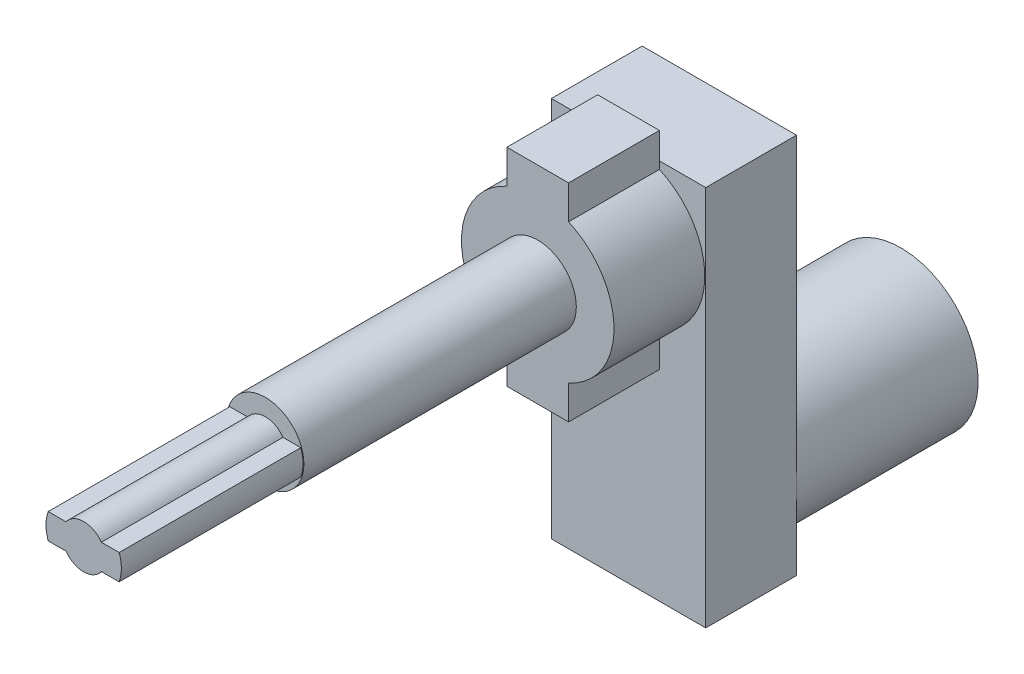
ISO-10303-21;
HEADER;
FILE_DESCRIPTION(('STEP AP214'),'2;1');
FILE_NAME('part.step','',(''),(''),'','','');
FILE_SCHEMA(('AUTOMOTIVE_DESIGN { 1 0 10303 214 1 1 1 1 }'));
ENDSEC;
DATA;
#1=APPLICATION_CONTEXT('core data for automotive mechanical design processes');
#2=APPLICATION_PROTOCOL_DEFINITION('international standard','automotive_design',2000,#1);
#3=PRODUCT_CONTEXT('',#1,'mechanical');
#4=PRODUCT('Part','Part','',(#3));
#5=PRODUCT_RELATED_PRODUCT_CATEGORY('part','',(#4));
#6=PRODUCT_DEFINITION_FORMATION('','',#4);
#7=PRODUCT_DEFINITION_CONTEXT('part definition',#1,'design');
#8=PRODUCT_DEFINITION('design','',#6,#7);
#9=PRODUCT_DEFINITION_SHAPE('','',#8);
#10=(LENGTH_UNIT() NAMED_UNIT(*) SI_UNIT(.MILLI.,.METRE.));
#11=(NAMED_UNIT(*) PLANE_ANGLE_UNIT() SI_UNIT($,.RADIAN.));
#12=(NAMED_UNIT(*) SI_UNIT($,.STERADIAN.) SOLID_ANGLE_UNIT());
#13=UNCERTAINTY_MEASURE_WITH_UNIT(LENGTH_MEASURE(1.E-05),#10,'distance_accuracy_value','');
#14=(GEOMETRIC_REPRESENTATION_CONTEXT(3) GLOBAL_UNCERTAINTY_ASSIGNED_CONTEXT((#13)) GLOBAL_UNIT_ASSIGNED_CONTEXT((#10,
#11,#12)) REPRESENTATION_CONTEXT('',''));
#15=CARTESIAN_POINT('',(0.,0.,0.));
#16=DIRECTION('',(0.,0.,1.));
#17=DIRECTION('',(1.,0.,0.));
#18=AXIS2_PLACEMENT_3D('',#15,#16,#17);
#19=CARTESIAN_POINT('',(0.,0.,-14.));
#20=DIRECTION('',(0.,0.,1.));
#21=DIRECTION('',(1.,0.,0.));
#22=AXIS2_PLACEMENT_3D('',#19,#20,#21);
#23=PLANE('',#22);
#24=DIRECTION('',(1.,0.,0.));
#25=VECTOR('',#24,1.);
#26=CARTESIAN_POINT('',(8.5,8.5,-14.));
#27=LINE('',#26,#25);
#28=CARTESIAN_POINT('',(-3.4,8.5,-14.));
#29=VERTEX_POINT('',#28);
#30=CARTESIAN_POINT('',(3.4,8.5,-14.));
#31=VERTEX_POINT('',#30);
#32=EDGE_CURVE('E11',#29,#31,#27,.T.);
#33=ORIENTED_EDGE('',*,*,#32,.F.);
#34=DIRECTION('',(0.,-1.,0.));
#35=VECTOR('',#34,1.);
#36=CARTESIAN_POINT('',(-3.4,11.4,-14.));
#37=LINE('',#36,#35);
#38=CARTESIAN_POINT('',(-3.4,11.4,-14.));
#39=VERTEX_POINT('',#38);
#40=EDGE_CURVE('E346',#39,#29,#37,.T.);
#41=ORIENTED_EDGE('',*,*,#40,.F.);
#42=DIRECTION('',(-1.,0.,0.));
#43=VECTOR('',#42,1.);
#44=CARTESIAN_POINT('',(3.4,11.4,-14.));
#45=LINE('',#44,#43);
#46=CARTESIAN_POINT('',(3.4,11.4,-14.));
#47=VERTEX_POINT('',#46);
#48=EDGE_CURVE('E343',#47,#39,#45,.T.);
#49=ORIENTED_EDGE('',*,*,#48,.F.);
#50=DIRECTION('',(0.,1.,0.));
#51=VECTOR('',#50,1.);
#52=CARTESIAN_POINT('',(3.4,11.4,-14.));
#53=LINE('',#52,#51);
#54=EDGE_CURVE('E340',#31,#47,#53,.T.);
#55=ORIENTED_EDGE('',*,*,#54,.F.);
#56=EDGE_LOOP('',(#33,#41,#49,#55));
#57=FACE_BOUND('',#56,.T.);
#58=ADVANCED_FACE('F34',(#57),#23,.F.);
#59=CARTESIAN_POINT('',(0.,0.,26.));
#60=DIRECTION('',(0.,0.,-1.));
#61=DIRECTION('',(-1.,0.,0.));
#62=AXIS2_PLACEMENT_3D('',#59,#60,#61);
#63=CYLINDRICAL_SURFACE('',#62,4.25);
#64=CARTESIAN_POINT('',(0.,0.,26.));
#65=DIRECTION('',(0.,0.,1.));
#66=DIRECTION('',(1.,0.,0.));
#67=AXIS2_PLACEMENT_3D('',#64,#65,#66);
#68=CIRCLE('',#67,4.25);
#69=CARTESIAN_POINT('',(4.25,0.,26.));
#70=VERTEX_POINT('',#69);
#71=EDGE_CURVE('E43',#70,#70,#68,.T.);
#72=ORIENTED_EDGE('',*,*,#71,.F.);
#73=EDGE_LOOP('',(#72));
#74=FACE_BOUND('',#73,.T.);
#75=CARTESIAN_POINT('',(0.,0.,-4.));
#76=DIRECTION('',(0.,0.,1.));
#77=DIRECTION('',(1.,0.,0.));
#78=AXIS2_PLACEMENT_3D('',#75,#76,#77);
#79=CIRCLE('',#78,4.25);
#80=CARTESIAN_POINT('',(4.25,0.,-4.));
#81=VERTEX_POINT('',#80);
#82=EDGE_CURVE('E38',#81,#81,#79,.T.);
#83=ORIENTED_EDGE('',*,*,#82,.T.);
#84=EDGE_LOOP('',(#83));
#85=FACE_BOUND('',#84,.T.);
#86=ADVANCED_FACE('F36',(#74,#85),#63,.T.);
#87=CARTESIAN_POINT('',(0.,0.,26.));
#88=DIRECTION('',(0.,0.,1.));
#89=DIRECTION('',(1.,0.,0.));
#90=AXIS2_PLACEMENT_3D('',#87,#88,#89);
#91=PLANE('',#90);
#92=CARTESIAN_POINT('',(0.,0.,26.));
#93=DIRECTION('',(0.,0.,1.));
#94=DIRECTION('',(1.,0.,0.));
#95=AXIS2_PLACEMENT_3D('',#92,#93,#94);
#96=CIRCLE('',#95,2.4);
#97=CARTESIAN_POINT('',(-1.94935886896179,-1.4,26.));
#98=VERTEX_POINT('',#97);
#99=CARTESIAN_POINT('',(1.94935886896179,-1.4,26.));
#100=VERTEX_POINT('',#99);
#101=EDGE_CURVE('E53',#98,#100,#96,.T.);
#102=ORIENTED_EDGE('',*,*,#101,.F.);
#103=DIRECTION('',(1.,0.,0.));
#104=VECTOR('',#103,1.);
#105=CARTESIAN_POINT('',(-1.94935886896179,-1.4,26.));
#106=LINE('',#105,#104);
#107=CARTESIAN_POINT('',(-3.90672497112351,-1.4,26.));
#108=VERTEX_POINT('',#107);
#109=EDGE_CURVE('E57',#108,#98,#106,.T.);
#110=ORIENTED_EDGE('',*,*,#109,.F.);
#111=CARTESIAN_POINT('',(0.,0.,26.));
#112=DIRECTION('',(0.,0.,1.));
#113=DIRECTION('',(1.,0.,0.));
#114=AXIS2_PLACEMENT_3D('',#111,#112,#113);
#115=CIRCLE('',#114,4.15);
#116=CARTESIAN_POINT('',(-3.90672497112351,1.4,26.));
#117=VERTEX_POINT('',#116);
#118=EDGE_CURVE('E777',#117,#108,#115,.T.);
#119=ORIENTED_EDGE('',*,*,#118,.F.);
#120=DIRECTION('',(-1.,0.,0.));
#121=VECTOR('',#120,1.);
#122=CARTESIAN_POINT('',(-1.94935886896179,1.4,26.));
#123=LINE('',#122,#121);
#124=CARTESIAN_POINT('',(-1.94935886896179,1.4,26.));
#125=VERTEX_POINT('',#124);
#126=EDGE_CURVE('E811',#125,#117,#123,.T.);
#127=ORIENTED_EDGE('',*,*,#126,.F.);
#128=CARTESIAN_POINT('',(0.,0.,26.));
#129=DIRECTION('',(0.,0.,1.));
#130=DIRECTION('',(1.,0.,0.));
#131=AXIS2_PLACEMENT_3D('',#128,#129,#130);
#132=CIRCLE('',#131,2.4);
#133=CARTESIAN_POINT('',(1.94935886896179,1.4,26.));
#134=VERTEX_POINT('',#133);
#135=EDGE_CURVE('E804',#134,#125,#132,.T.);
#136=ORIENTED_EDGE('',*,*,#135,.F.);
#137=DIRECTION('',(-1.,0.,0.));
#138=VECTOR('',#137,1.);
#139=CARTESIAN_POINT('',(3.90672497112351,1.4,26.));
#140=LINE('',#139,#138);
#141=CARTESIAN_POINT('',(3.90672497112351,1.4,26.));
#142=VERTEX_POINT('',#141);
#143=EDGE_CURVE('E798',#142,#134,#140,.T.);
#144=ORIENTED_EDGE('',*,*,#143,.F.);
#145=CARTESIAN_POINT('',(0.,0.,26.));
#146=DIRECTION('',(0.,0.,1.));
#147=DIRECTION('',(1.,0.,0.));
#148=AXIS2_PLACEMENT_3D('',#145,#146,#147);
#149=CIRCLE('',#148,4.15);
#150=CARTESIAN_POINT('',(3.90672497112351,-1.4,26.));
#151=VERTEX_POINT('',#150);
#152=EDGE_CURVE('E801',#151,#142,#149,.T.);
#153=ORIENTED_EDGE('',*,*,#152,.F.);
#154=DIRECTION('',(1.,0.,0.));
#155=VECTOR('',#154,1.);
#156=CARTESIAN_POINT('',(3.90672497112351,-1.4,26.));
#157=LINE('',#156,#155);
#158=EDGE_CURVE('E802',#100,#151,#157,.T.);
#159=ORIENTED_EDGE('',*,*,#158,.F.);
#160=EDGE_LOOP('',(#102,#110,#119,#127,#136,#144,#153,#159));
#161=FACE_BOUND('',#160,.T.);
#162=ORIENTED_EDGE('',*,*,#71,.T.);
#163=EDGE_LOOP('',(#162));
#164=FACE_BOUND('',#163,.T.);
#165=ADVANCED_FACE('F474',(#161,#164),#91,.T.);
#166=CARTESIAN_POINT('',(-3.4,-7.68114574786861,-4.));
#167=DIRECTION('',(1.,0.,0.));
#168=DIRECTION('',(0.,1.,0.));
#169=AXIS2_PLACEMENT_3D('',#166,#167,#168);
#170=PLANE('',#169);
#171=DIRECTION('',(0.,-1.,0.));
#172=VECTOR('',#171,1.);
#173=CARTESIAN_POINT('',(-3.4,-7.68114574786861,-14.));
#174=LINE('',#173,#172);
#175=CARTESIAN_POINT('',(-3.4,-7.68114574786861,-14.));
#176=VERTEX_POINT('',#175);
#177=CARTESIAN_POINT('',(-3.4,-11.4,-14.));
#178=VERTEX_POINT('',#177);
#179=EDGE_CURVE('E331',#176,#178,#174,.T.);
#180=ORIENTED_EDGE('',*,*,#179,.T.);
#181=DIRECTION('',(0.,0.,-1.));
#182=VECTOR('',#181,1.);
#183=CARTESIAN_POINT('',(-3.4,-11.4,-4.));
#184=LINE('',#183,#182);
#185=CARTESIAN_POINT('',(-3.4,-11.4,-4.));
#186=VERTEX_POINT('',#185);
#187=EDGE_CURVE('E370',#186,#178,#184,.T.);
#188=ORIENTED_EDGE('',*,*,#187,.F.);
#189=DIRECTION('',(0.,-1.,0.));
#190=VECTOR('',#189,1.);
#191=CARTESIAN_POINT('',(-3.4,-7.68114574786861,-4.));
#192=LINE('',#191,#190);
#193=CARTESIAN_POINT('',(-3.4,-7.68114574786861,-4.));
#194=VERTEX_POINT('',#193);
#195=EDGE_CURVE('E312',#194,#186,#192,.T.);
#196=ORIENTED_EDGE('',*,*,#195,.F.);
#197=DIRECTION('',(0.,0.,-1.));
#198=VECTOR('',#197,1.);
#199=CARTESIAN_POINT('',(-3.4,-7.68114574786861,-4.));
#200=LINE('',#199,#198);
#201=EDGE_CURVE('E330',#194,#176,#200,.T.);
#202=ORIENTED_EDGE('',*,*,#201,.T.);
#203=EDGE_LOOP('',(#180,#188,#196,#202));
#204=FACE_BOUND('',#203,.T.);
#205=ADVANCED_FACE('F390',(#204),#170,.F.);
#206=CARTESIAN_POINT('',(3.4,-11.4,-4.));
#207=DIRECTION('',(0.,1.,0.));
#208=DIRECTION('',(0.,0.,1.));
#209=AXIS2_PLACEMENT_3D('',#206,#207,#208);
#210=PLANE('',#209);
#211=DIRECTION('',(1.,0.,0.));
#212=VECTOR('',#211,1.);
#213=CARTESIAN_POINT('',(3.4,-11.4,-14.));
#214=LINE('',#213,#212);
#215=CARTESIAN_POINT('',(3.4,-11.4,-14.));
#216=VERTEX_POINT('',#215);
#217=EDGE_CURVE('E334',#178,#216,#214,.T.);
#218=ORIENTED_EDGE('',*,*,#217,.T.);
#219=DIRECTION('',(0.,0.,-1.));
#220=VECTOR('',#219,1.);
#221=CARTESIAN_POINT('',(3.4,-11.4,-4.));
#222=LINE('',#221,#220);
#223=CARTESIAN_POINT('',(3.4,-11.4,-4.));
#224=VERTEX_POINT('',#223);
#225=EDGE_CURVE('E367',#224,#216,#222,.T.);
#226=ORIENTED_EDGE('',*,*,#225,.F.);
#227=DIRECTION('',(1.,0.,0.));
#228=VECTOR('',#227,1.);
#229=CARTESIAN_POINT('',(3.4,-11.4,-4.));
#230=LINE('',#229,#228);
#231=EDGE_CURVE('E315',#186,#224,#230,.T.);
#232=ORIENTED_EDGE('',*,*,#231,.F.);
#233=ORIENTED_EDGE('',*,*,#187,.T.);
#234=EDGE_LOOP('',(#218,#226,#232,#233));
#235=FACE_BOUND('',#234,.T.);
#236=ADVANCED_FACE('F394',(#235),#210,.F.);
#237=CARTESIAN_POINT('',(3.4,-7.68114574786861,-4.));
#238=DIRECTION('',(-1.,0.,0.));
#239=DIRECTION('',(0.,0.,1.));
#240=AXIS2_PLACEMENT_3D('',#237,#238,#239);
#241=PLANE('',#240);
#242=DIRECTION('',(0.,1.,0.));
#243=VECTOR('',#242,1.);
#244=CARTESIAN_POINT('',(3.4,-7.68114574786861,-14.));
#245=LINE('',#244,#243);
#246=CARTESIAN_POINT('',(3.4,-7.68114574786861,-14.));
#247=VERTEX_POINT('',#246);
#248=EDGE_CURVE('E336',#216,#247,#245,.T.);
#249=ORIENTED_EDGE('',*,*,#248,.T.);
#250=DIRECTION('',(0.,0.,-1.));
#251=VECTOR('',#250,1.);
#252=CARTESIAN_POINT('',(3.4,-7.68114574786861,-4.));
#253=LINE('',#252,#251);
#254=CARTESIAN_POINT('',(3.4,-7.68114574786861,-4.));
#255=VERTEX_POINT('',#254);
#256=EDGE_CURVE('E364',#255,#247,#253,.T.);
#257=ORIENTED_EDGE('',*,*,#256,.F.);
#258=DIRECTION('',(0.,1.,0.));
#259=VECTOR('',#258,1.);
#260=CARTESIAN_POINT('',(3.4,-7.68114574786861,-4.));
#261=LINE('',#260,#259);
#262=EDGE_CURVE('E318',#224,#255,#261,.T.);
#263=ORIENTED_EDGE('',*,*,#262,.F.);
#264=ORIENTED_EDGE('',*,*,#225,.T.);
#265=EDGE_LOOP('',(#249,#257,#263,#264));
#266=FACE_BOUND('',#265,.T.);
#267=ADVANCED_FACE('F399',(#266),#241,.F.);
#268=CARTESIAN_POINT('',(0.,0.,-4.));
#269=DIRECTION('',(0.,0.,-1.));
#270=DIRECTION('',(-1.,0.,0.));
#271=AXIS2_PLACEMENT_3D('',#268,#269,#270);
#272=CYLINDRICAL_SURFACE('',#271,8.4);
#273=CARTESIAN_POINT('',(0.,0.,-14.));
#274=DIRECTION('',(0.,0.,1.));
#275=DIRECTION('',(1.,0.,0.));
#276=AXIS2_PLACEMENT_3D('',#273,#274,#275);
#277=CIRCLE('',#276,8.4);
#278=CARTESIAN_POINT('',(3.4,7.68114574786861,-14.));
#279=VERTEX_POINT('',#278);
#280=EDGE_CURVE('E338',#247,#279,#277,.T.);
#281=ORIENTED_EDGE('',*,*,#280,.T.);
#282=DIRECTION('',(0.,0.,-1.));
#283=VECTOR('',#282,1.);
#284=CARTESIAN_POINT('',(3.4,7.68114574786861,-4.));
#285=LINE('',#284,#283);
#286=CARTESIAN_POINT('',(3.4,7.68114574786861,-4.));
#287=VERTEX_POINT('',#286);
#288=EDGE_CURVE('E361',#287,#279,#285,.T.);
#289=ORIENTED_EDGE('',*,*,#288,.F.);
#290=CARTESIAN_POINT('',(0.,0.,-4.));
#291=DIRECTION('',(0.,0.,1.));
#292=DIRECTION('',(1.,0.,0.));
#293=AXIS2_PLACEMENT_3D('',#290,#291,#292);
#294=CIRCLE('',#293,8.4);
#295=EDGE_CURVE('E320',#255,#287,#294,.T.);
#296=ORIENTED_EDGE('',*,*,#295,.F.);
#297=ORIENTED_EDGE('',*,*,#256,.T.);
#298=EDGE_LOOP('',(#281,#289,#296,#297));
#299=FACE_BOUND('',#298,.T.);
#300=ADVANCED_FACE('F405',(#299),#272,.T.);
#301=CARTESIAN_POINT('',(3.4,11.4,-4.));
#302=DIRECTION('',(-1.,0.,0.));
#303=DIRECTION('',(0.,-1.,0.));
#304=AXIS2_PLACEMENT_3D('',#301,#302,#303);
#305=PLANE('',#304);
#306=EDGE_CURVE('E341',#279,#31,#53,.T.);
#307=ORIENTED_EDGE('',*,*,#306,.T.);
#308=ORIENTED_EDGE('',*,*,#54,.T.);
#309=DIRECTION('',(0.,0.,-1.));
#310=VECTOR('',#309,1.);
#311=CARTESIAN_POINT('',(3.4,11.4,-4.));
#312=LINE('',#311,#310);
#313=CARTESIAN_POINT('',(3.4,11.4,-4.));
#314=VERTEX_POINT('',#313);
#315=EDGE_CURVE('E358',#314,#47,#312,.T.);
#316=ORIENTED_EDGE('',*,*,#315,.F.);
#317=DIRECTION('',(0.,1.,0.));
#318=VECTOR('',#317,1.);
#319=CARTESIAN_POINT('',(3.4,11.4,-4.));
#320=LINE('',#319,#318);
#321=EDGE_CURVE('E322',#287,#314,#320,.T.);
#322=ORIENTED_EDGE('',*,*,#321,.F.);
#323=ORIENTED_EDGE('',*,*,#288,.T.);
#324=EDGE_LOOP('',(#307,#308,#316,#322,#323));
#325=FACE_BOUND('',#324,.T.);
#326=ADVANCED_FACE('F409',(#325),#305,.F.);
#327=CARTESIAN_POINT('',(3.4,11.4,-4.));
#328=DIRECTION('',(0.,-1.,0.));
#329=DIRECTION('',(0.,0.,-1.));
#330=AXIS2_PLACEMENT_3D('',#327,#328,#329);
#331=PLANE('',#330);
#332=ORIENTED_EDGE('',*,*,#48,.T.);
#333=DIRECTION('',(0.,0.,-1.));
#334=VECTOR('',#333,1.);
#335=CARTESIAN_POINT('',(-3.4,11.4,-4.));
#336=LINE('',#335,#334);
#337=CARTESIAN_POINT('',(-3.4,11.4,-4.));
#338=VERTEX_POINT('',#337);
#339=EDGE_CURVE('E355',#338,#39,#336,.T.);
#340=ORIENTED_EDGE('',*,*,#339,.F.);
#341=DIRECTION('',(-1.,0.,0.));
#342=VECTOR('',#341,1.);
#343=CARTESIAN_POINT('',(3.4,11.4,-4.));
#344=LINE('',#343,#342);
#345=EDGE_CURVE('E324',#314,#338,#344,.T.);
#346=ORIENTED_EDGE('',*,*,#345,.F.);
#347=ORIENTED_EDGE('',*,*,#315,.T.);
#348=EDGE_LOOP('',(#332,#340,#346,#347));
#349=FACE_BOUND('',#348,.T.);
#350=ADVANCED_FACE('F415',(#349),#331,.F.);
#351=CARTESIAN_POINT('',(-3.4,11.4,-4.));
#352=DIRECTION('',(1.,0.,0.));
#353=DIRECTION('',(0.,1.,0.));
#354=AXIS2_PLACEMENT_3D('',#351,#352,#353);
#355=PLANE('',#354);
#356=ORIENTED_EDGE('',*,*,#40,.T.);
#357=CARTESIAN_POINT('',(-3.4,7.68114574786861,-14.));
#358=VERTEX_POINT('',#357);
#359=EDGE_CURVE('E345',#29,#358,#37,.T.);
#360=ORIENTED_EDGE('',*,*,#359,.T.);
#361=DIRECTION('',(0.,0.,-1.));
#362=VECTOR('',#361,1.);
#363=CARTESIAN_POINT('',(-3.4,7.68114574786861,-4.));
#364=LINE('',#363,#362);
#365=CARTESIAN_POINT('',(-3.4,7.68114574786861,-4.));
#366=VERTEX_POINT('',#365);
#367=EDGE_CURVE('E352',#366,#358,#364,.T.);
#368=ORIENTED_EDGE('',*,*,#367,.F.);
#369=DIRECTION('',(0.,-1.,0.));
#370=VECTOR('',#369,1.);
#371=CARTESIAN_POINT('',(-3.4,11.4,-4.));
#372=LINE('',#371,#370);
#373=EDGE_CURVE('E326',#338,#366,#372,.T.);
#374=ORIENTED_EDGE('',*,*,#373,.F.);
#375=ORIENTED_EDGE('',*,*,#339,.T.);
#376=EDGE_LOOP('',(#356,#360,#368,#374,#375));
#377=FACE_BOUND('',#376,.T.);
#378=ADVANCED_FACE('F419',(#377),#355,.F.);
#379=CARTESIAN_POINT('',(0.,0.,-4.));
#380=DIRECTION('',(0.,0.,-1.));
#381=DIRECTION('',(-1.,0.,0.));
#382=AXIS2_PLACEMENT_3D('',#379,#380,#381);
#383=CYLINDRICAL_SURFACE('',#382,8.4);
#384=CARTESIAN_POINT('',(0.,0.,-14.));
#385=DIRECTION('',(0.,0.,1.));
#386=DIRECTION('',(1.,0.,0.));
#387=AXIS2_PLACEMENT_3D('',#384,#385,#386);
#388=CIRCLE('',#387,8.4);
#389=EDGE_CURVE('E316',#358,#176,#388,.T.);
#390=ORIENTED_EDGE('',*,*,#389,.T.);
#391=ORIENTED_EDGE('',*,*,#201,.F.);
#392=CARTESIAN_POINT('',(0.,0.,-4.));
#393=DIRECTION('',(0.,0.,1.));
#394=DIRECTION('',(1.,0.,0.));
#395=AXIS2_PLACEMENT_3D('',#392,#393,#394);
#396=CIRCLE('',#395,8.4);
#397=EDGE_CURVE('E328',#366,#194,#396,.T.);
#398=ORIENTED_EDGE('',*,*,#397,.F.);
#399=ORIENTED_EDGE('',*,*,#367,.T.);
#400=EDGE_LOOP('',(#390,#391,#398,#399));
#401=FACE_BOUND('',#400,.T.);
#402=ADVANCED_FACE('F382',(#401),#383,.T.);
#403=CARTESIAN_POINT('',(0.,0.,-4.));
#404=DIRECTION('',(0.,0.,1.));
#405=DIRECTION('',(1.,0.,0.));
#406=AXIS2_PLACEMENT_3D('',#403,#404,#405);
#407=PLANE('',#406);
#408=ORIENTED_EDGE('',*,*,#82,.F.);
#409=EDGE_LOOP('',(#408));
#410=FACE_BOUND('',#409,.T.);
#411=ORIENTED_EDGE('',*,*,#195,.T.);
#412=ORIENTED_EDGE('',*,*,#231,.T.);
#413=ORIENTED_EDGE('',*,*,#262,.T.);
#414=ORIENTED_EDGE('',*,*,#295,.T.);
#415=ORIENTED_EDGE('',*,*,#321,.T.);
#416=ORIENTED_EDGE('',*,*,#345,.T.);
#417=ORIENTED_EDGE('',*,*,#373,.T.);
#418=ORIENTED_EDGE('',*,*,#397,.T.);
#419=EDGE_LOOP('',(#411,#412,#413,#414,#415,#416,#417,#418));
#420=FACE_BOUND('',#419,.T.);
#421=ADVANCED_FACE('F378',(#410,#420),#407,.T.);
#422=CARTESIAN_POINT('',(0.,0.,-24.));
#423=DIRECTION('',(0.,0.,-1.));
#424=DIRECTION('',(-1.,0.,0.));
#425=AXIS2_PLACEMENT_3D('',#422,#423,#424);
#426=PLANE('',#425);
#427=CARTESIAN_POINT('',(0.,-25.,-24.));
#428=DIRECTION('',(0.,0.,-1.));
#429=DIRECTION('',(-1.,0.,0.));
#430=AXIS2_PLACEMENT_3D('',#427,#428,#429);
#431=CIRCLE('',#430,8.5);
#432=CARTESIAN_POINT('',(-8.5,-25.,-24.));
#433=VERTEX_POINT('',#432);
#434=CARTESIAN_POINT('',(8.49999999999999,-25.,-24.));
#435=VERTEX_POINT('',#434);
#436=EDGE_CURVE('E265',#433,#435,#431,.T.);
#437=ORIENTED_EDGE('',*,*,#436,.F.);
#438=DIRECTION('',(0.,1.,0.));
#439=VECTOR('',#438,1.);
#440=CARTESIAN_POINT('',(-8.5,8.5,-24.));
#441=LINE('',#440,#439);
#442=CARTESIAN_POINT('',(-8.5,8.5,-24.));
#443=VERTEX_POINT('',#442);
#444=EDGE_CURVE('E297',#433,#443,#441,.T.);
#445=ORIENTED_EDGE('',*,*,#444,.T.);
#446=DIRECTION('',(1.,0.,0.));
#447=VECTOR('',#446,1.);
#448=CARTESIAN_POINT('',(8.5,8.5,-24.));
#449=LINE('',#448,#447);
#450=CARTESIAN_POINT('',(8.5,8.5,-24.));
#451=VERTEX_POINT('',#450);
#452=EDGE_CURVE('E283',#443,#451,#449,.T.);
#453=ORIENTED_EDGE('',*,*,#452,.T.);
#454=DIRECTION('',(0.,-1.,0.));
#455=VECTOR('',#454,1.);
#456=CARTESIAN_POINT('',(8.5,8.5,-24.));
#457=LINE('',#456,#455);
#458=EDGE_CURVE('E290',#451,#435,#457,.T.);
#459=ORIENTED_EDGE('',*,*,#458,.T.);
#460=EDGE_LOOP('',(#437,#445,#453,#459));
#461=FACE_BOUND('',#460,.T.);
#462=ADVANCED_FACE('F381',(#461),#426,.T.);
#463=CARTESIAN_POINT('',(0.,-33.5,-24.));
#464=VERTEX_POINT('',#463);
#465=EDGE_CURVE('E278',#435,#464,#431,.T.);
#466=ORIENTED_EDGE('',*,*,#465,.F.);
#467=CARTESIAN_POINT('',(8.5,-33.5,-24.));
#468=VERTEX_POINT('',#467);
#469=EDGE_CURVE('E275',#435,#468,#457,.T.);
#470=ORIENTED_EDGE('',*,*,#469,.T.);
#471=DIRECTION('',(-1.,0.,0.));
#472=VECTOR('',#471,1.);
#473=CARTESIAN_POINT('',(8.5,-33.5,-24.));
#474=LINE('',#473,#472);
#475=EDGE_CURVE('E294',#468,#464,#474,.T.);
#476=ORIENTED_EDGE('',*,*,#475,.T.);
#477=EDGE_LOOP('',(#466,#470,#476));
#478=FACE_BOUND('',#477,.T.);
#479=ADVANCED_FACE('F459',(#478),#426,.T.);
#480=CARTESIAN_POINT('',(0.,0.,-14.));
#481=DIRECTION('',(0.,0.,-1.));
#482=DIRECTION('',(-1.,0.,0.));
#483=AXIS2_PLACEMENT_3D('',#480,#481,#482);
#484=PLANE('',#483);
#485=ORIENTED_EDGE('',*,*,#359,.F.);
#486=CARTESIAN_POINT('',(-8.5,8.5,-14.));
#487=VERTEX_POINT('',#486);
#488=EDGE_CURVE('E45',#487,#29,#27,.T.);
#489=ORIENTED_EDGE('',*,*,#488,.F.);
#490=DIRECTION('',(0.,1.,0.));
#491=VECTOR('',#490,1.);
#492=CARTESIAN_POINT('',(-8.5,8.5,-14.));
#493=LINE('',#492,#491);
#494=CARTESIAN_POINT('',(-8.5,-33.5,-14.));
#495=VERTEX_POINT('',#494);
#496=EDGE_CURVE('E286',#495,#487,#493,.T.);
#497=ORIENTED_EDGE('',*,*,#496,.F.);
#498=DIRECTION('',(-1.,0.,0.));
#499=VECTOR('',#498,1.);
#500=CARTESIAN_POINT('',(8.5,-33.5,-14.));
#501=LINE('',#500,#499);
#502=CARTESIAN_POINT('',(8.5,-33.5,-14.));
#503=VERTEX_POINT('',#502);
#504=EDGE_CURVE('E282',#503,#495,#501,.T.);
#505=ORIENTED_EDGE('',*,*,#504,.F.);
#506=DIRECTION('',(0.,-1.,0.));
#507=VECTOR('',#506,1.);
#508=CARTESIAN_POINT('',(8.5,8.5,-14.));
#509=LINE('',#508,#507);
#510=CARTESIAN_POINT('',(8.5,8.5,-14.));
#511=VERTEX_POINT('',#510);
#512=EDGE_CURVE('E280',#511,#503,#509,.T.);
#513=ORIENTED_EDGE('',*,*,#512,.F.);
#514=EDGE_CURVE('E46',#31,#511,#27,.T.);
#515=ORIENTED_EDGE('',*,*,#514,.F.);
#516=ORIENTED_EDGE('',*,*,#306,.F.);
#517=ORIENTED_EDGE('',*,*,#280,.F.);
#518=ORIENTED_EDGE('',*,*,#248,.F.);
#519=ORIENTED_EDGE('',*,*,#217,.F.);
#520=ORIENTED_EDGE('',*,*,#179,.F.);
#521=ORIENTED_EDGE('',*,*,#389,.F.);
#522=EDGE_LOOP('',(#485,#489,#497,#505,#513,#515,#516,#517,#518,#519,#520,#521));
#523=FACE_BOUND('',#522,.T.);
#524=ADVANCED_FACE('F424',(#523),#484,.F.);
#525=CARTESIAN_POINT('',(8.5,8.5,-14.));
#526=DIRECTION('',(1.,0.,0.));
#527=DIRECTION('',(0.,1.,0.));
#528=AXIS2_PLACEMENT_3D('',#525,#526,#527);
#529=PLANE('',#528);
#530=ORIENTED_EDGE('',*,*,#512,.T.);
#531=DIRECTION('',(0.,0.,-1.));
#532=VECTOR('',#531,1.);
#533=CARTESIAN_POINT('',(8.5,-33.5,-14.));
#534=LINE('',#533,#532);
#535=EDGE_CURVE('E289',#503,#468,#534,.T.);
#536=ORIENTED_EDGE('',*,*,#535,.T.);
#537=ORIENTED_EDGE('',*,*,#469,.F.);
#538=ORIENTED_EDGE('',*,*,#458,.F.);
#539=DIRECTION('',(0.,0.,-1.));
#540=VECTOR('',#539,1.);
#541=CARTESIAN_POINT('',(8.5,8.5,-14.));
#542=LINE('',#541,#540);
#543=EDGE_CURVE('E301',#511,#451,#542,.T.);
#544=ORIENTED_EDGE('',*,*,#543,.F.);
#545=EDGE_LOOP('',(#530,#536,#537,#538,#544));
#546=FACE_BOUND('',#545,.T.);
#547=ADVANCED_FACE('F448',(#546),#529,.T.);
#548=CARTESIAN_POINT('',(8.5,8.5,-14.));
#549=DIRECTION('',(0.,1.,0.));
#550=DIRECTION('',(0.,0.,1.));
#551=AXIS2_PLACEMENT_3D('',#548,#549,#550);
#552=PLANE('',#551);
#553=ORIENTED_EDGE('',*,*,#488,.T.);
#554=ORIENTED_EDGE('',*,*,#32,.T.);
#555=ORIENTED_EDGE('',*,*,#514,.T.);
#556=ORIENTED_EDGE('',*,*,#543,.T.);
#557=ORIENTED_EDGE('',*,*,#452,.F.);
#558=DIRECTION('',(0.,0.,-1.));
#559=VECTOR('',#558,1.);
#560=CARTESIAN_POINT('',(-8.5,8.5,-14.));
#561=LINE('',#560,#559);
#562=EDGE_CURVE('E304',#487,#443,#561,.T.);
#563=ORIENTED_EDGE('',*,*,#562,.F.);
#564=EDGE_LOOP('',(#553,#554,#555,#556,#557,#563));
#565=FACE_BOUND('',#564,.T.);
#566=ADVANCED_FACE('F433',(#565),#552,.T.);
#567=CARTESIAN_POINT('',(-8.5,8.5,-14.));
#568=DIRECTION('',(-1.,0.,0.));
#569=DIRECTION('',(0.,0.,1.));
#570=AXIS2_PLACEMENT_3D('',#567,#568,#569);
#571=PLANE('',#570);
#572=ORIENTED_EDGE('',*,*,#496,.T.);
#573=ORIENTED_EDGE('',*,*,#562,.T.);
#574=ORIENTED_EDGE('',*,*,#444,.F.);
#575=CARTESIAN_POINT('',(-8.5,-33.5,-24.));
#576=VERTEX_POINT('',#575);
#577=EDGE_CURVE('E298',#576,#433,#441,.T.);
#578=ORIENTED_EDGE('',*,*,#577,.F.);
#579=DIRECTION('',(0.,0.,-1.));
#580=VECTOR('',#579,1.);
#581=CARTESIAN_POINT('',(-8.5,-33.5,-14.));
#582=LINE('',#581,#580);
#583=EDGE_CURVE('E307',#495,#576,#582,.T.);
#584=ORIENTED_EDGE('',*,*,#583,.F.);
#585=EDGE_LOOP('',(#572,#573,#574,#578,#584));
#586=FACE_BOUND('',#585,.T.);
#587=ADVANCED_FACE('F437',(#586),#571,.T.);
#588=CARTESIAN_POINT('',(8.5,-33.5,-14.));
#589=DIRECTION('',(0.,-1.,0.));
#590=DIRECTION('',(0.,0.,-1.));
#591=AXIS2_PLACEMENT_3D('',#588,#589,#590);
#592=PLANE('',#591);
#593=ORIENTED_EDGE('',*,*,#475,.F.);
#594=ORIENTED_EDGE('',*,*,#535,.F.);
#595=ORIENTED_EDGE('',*,*,#504,.T.);
#596=ORIENTED_EDGE('',*,*,#583,.T.);
#597=EDGE_CURVE('E293',#464,#576,#474,.T.);
#598=ORIENTED_EDGE('',*,*,#597,.F.);
#599=EDGE_LOOP('',(#593,#594,#595,#596,#598));
#600=FACE_BOUND('',#599,.T.);
#601=ADVANCED_FACE('F444',(#600),#592,.T.);
#602=EDGE_CURVE('E279',#464,#433,#431,.T.);
#603=ORIENTED_EDGE('',*,*,#602,.F.);
#604=ORIENTED_EDGE('',*,*,#597,.T.);
#605=ORIENTED_EDGE('',*,*,#577,.T.);
#606=EDGE_LOOP('',(#603,#604,#605));
#607=FACE_BOUND('',#606,.T.);
#608=ADVANCED_FACE('F457',(#607),#426,.T.);
#609=CARTESIAN_POINT('',(0.,-25.,-44.));
#610=DIRECTION('',(0.,0.,1.));
#611=DIRECTION('',(1.,0.,0.));
#612=AXIS2_PLACEMENT_3D('',#609,#610,#611);
#613=CYLINDRICAL_SURFACE('',#612,8.5);
#614=CARTESIAN_POINT('',(0.,-25.,-44.));
#615=DIRECTION('',(0.,0.,-1.));
#616=DIRECTION('',(-1.,0.,0.));
#617=AXIS2_PLACEMENT_3D('',#614,#615,#616);
#618=CIRCLE('',#617,8.5);
#619=CARTESIAN_POINT('',(-8.5,-25.,-44.));
#620=VERTEX_POINT('',#619);
#621=EDGE_CURVE('E272',#620,#620,#618,.T.);
#622=ORIENTED_EDGE('',*,*,#621,.F.);
#623=EDGE_LOOP('',(#622));
#624=FACE_BOUND('',#623,.T.);
#625=ORIENTED_EDGE('',*,*,#436,.T.);
#626=ORIENTED_EDGE('',*,*,#465,.T.);
#627=ORIENTED_EDGE('',*,*,#602,.T.);
#628=EDGE_LOOP('',(#625,#626,#627));
#629=FACE_BOUND('',#628,.T.);
#630=ADVANCED_FACE('F455',(#624,#629),#613,.T.);
#631=CARTESIAN_POINT('',(0.,-25.,-44.));
#632=DIRECTION('',(0.,0.,-1.));
#633=DIRECTION('',(-1.,0.,0.));
#634=AXIS2_PLACEMENT_3D('',#631,#632,#633);
#635=PLANE('',#634);
#636=DIRECTION('',(0.,-1.,0.));
#637=VECTOR('',#636,1.);
#638=CARTESIAN_POINT('',(3.5,-28.5,-44.));
#639=LINE('',#638,#637);
#640=CARTESIAN_POINT('',(3.5,-21.5,-44.));
#641=VERTEX_POINT('',#640);
#642=CARTESIAN_POINT('',(3.5,-28.5,-44.));
#643=VERTEX_POINT('',#642);
#644=EDGE_CURVE('E234',#641,#643,#639,.T.);
#645=ORIENTED_EDGE('',*,*,#644,.F.);
#646=DIRECTION('',(1.,0.,0.));
#647=VECTOR('',#646,1.);
#648=CARTESIAN_POINT('',(-3.5,-21.5,-44.));
#649=LINE('',#648,#647);
#650=CARTESIAN_POINT('',(-3.5,-21.5,-44.));
#651=VERTEX_POINT('',#650);
#652=EDGE_CURVE('E246',#651,#641,#649,.T.);
#653=ORIENTED_EDGE('',*,*,#652,.F.);
#654=DIRECTION('',(0.,1.,0.));
#655=VECTOR('',#654,1.);
#656=CARTESIAN_POINT('',(-3.5,-28.5,-44.));
#657=LINE('',#656,#655);
#658=CARTESIAN_POINT('',(-3.5,-28.5,-44.));
#659=VERTEX_POINT('',#658);
#660=EDGE_CURVE('E258',#659,#651,#657,.T.);
#661=ORIENTED_EDGE('',*,*,#660,.F.);
#662=DIRECTION('',(-1.,0.,0.));
#663=VECTOR('',#662,1.);
#664=CARTESIAN_POINT('',(-3.5,-28.5,-44.));
#665=LINE('',#664,#663);
#666=EDGE_CURVE('E236',#643,#659,#665,.T.);
#667=ORIENTED_EDGE('',*,*,#666,.F.);
#668=EDGE_LOOP('',(#645,#653,#661,#667));
#669=FACE_BOUND('',#668,.T.);
#670=ORIENTED_EDGE('',*,*,#621,.T.);
#671=EDGE_LOOP('',(#670));
#672=FACE_BOUND('',#671,.T.);
#673=ADVANCED_FACE('F599',(#669,#672),#635,.T.);
#674=CARTESIAN_POINT('',(3.5,-28.5,-24.));
#675=DIRECTION('',(1.,0.,0.));
#676=DIRECTION('',(0.,0.,-1.));
#677=AXIS2_PLACEMENT_3D('',#674,#675,#676);
#678=PLANE('',#677);
#679=ORIENTED_EDGE('',*,*,#644,.T.);
#680=DIRECTION('',(0.,0.,-1.));
#681=VECTOR('',#680,1.);
#682=CARTESIAN_POINT('',(3.5,-28.5,-24.));
#683=LINE('',#682,#681);
#684=CARTESIAN_POINT('',(3.5,-28.5,-24.));
#685=VERTEX_POINT('',#684);
#686=EDGE_CURVE('E254',#685,#643,#683,.T.);
#687=ORIENTED_EDGE('',*,*,#686,.F.);
#688=DIRECTION('',(0.,-1.,0.));
#689=VECTOR('',#688,1.);
#690=CARTESIAN_POINT('',(3.5,-28.5,-24.));
#691=LINE('',#690,#689);
#692=CARTESIAN_POINT('',(3.5,-21.5,-24.));
#693=VERTEX_POINT('',#692);
#694=EDGE_CURVE('E242',#693,#685,#691,.T.);
#695=ORIENTED_EDGE('',*,*,#694,.F.);
#696=DIRECTION('',(0.,0.,-1.));
#697=VECTOR('',#696,1.);
#698=CARTESIAN_POINT('',(3.5,-21.5,-24.));
#699=LINE('',#698,#697);
#700=EDGE_CURVE('E263',#693,#641,#699,.T.);
#701=ORIENTED_EDGE('',*,*,#700,.T.);
#702=EDGE_LOOP('',(#679,#687,#695,#701));
#703=FACE_BOUND('',#702,.T.);
#704=ADVANCED_FACE('F609',(#703),#678,.F.);
#705=CARTESIAN_POINT('',(-3.5,-21.5,-24.));
#706=DIRECTION('',(0.,1.,0.));
#707=DIRECTION('',(0.,0.,1.));
#708=AXIS2_PLACEMENT_3D('',#705,#706,#707);
#709=PLANE('',#708);
#710=ORIENTED_EDGE('',*,*,#652,.T.);
#711=ORIENTED_EDGE('',*,*,#700,.F.);
#712=DIRECTION('',(1.,0.,0.));
#713=VECTOR('',#712,1.);
#714=CARTESIAN_POINT('',(-3.5,-21.5,-24.));
#715=LINE('',#714,#713);
#716=CARTESIAN_POINT('',(-3.5,-21.5,-24.));
#717=VERTEX_POINT('',#716);
#718=EDGE_CURVE('E252',#717,#693,#715,.T.);
#719=ORIENTED_EDGE('',*,*,#718,.F.);
#720=DIRECTION('',(0.,0.,-1.));
#721=VECTOR('',#720,1.);
#722=CARTESIAN_POINT('',(-3.5,-21.5,-24.));
#723=LINE('',#722,#721);
#724=EDGE_CURVE('E266',#717,#651,#723,.T.);
#725=ORIENTED_EDGE('',*,*,#724,.T.);
#726=EDGE_LOOP('',(#710,#711,#719,#725));
#727=FACE_BOUND('',#726,.T.);
#728=ADVANCED_FACE('F619',(#727),#709,.F.);
#729=CARTESIAN_POINT('',(-3.5,-28.5,-24.));
#730=DIRECTION('',(-1.,0.,0.));
#731=DIRECTION('',(0.,0.,1.));
#732=AXIS2_PLACEMENT_3D('',#729,#730,#731);
#733=PLANE('',#732);
#734=ORIENTED_EDGE('',*,*,#660,.T.);
#735=ORIENTED_EDGE('',*,*,#724,.F.);
#736=DIRECTION('',(0.,1.,0.));
#737=VECTOR('',#736,1.);
#738=CARTESIAN_POINT('',(-3.5,-28.5,-24.));
#739=LINE('',#738,#737);
#740=CARTESIAN_POINT('',(-3.5,-28.5,-24.));
#741=VERTEX_POINT('',#740);
#742=EDGE_CURVE('E249',#741,#717,#739,.T.);
#743=ORIENTED_EDGE('',*,*,#742,.F.);
#744=DIRECTION('',(0.,0.,-1.));
#745=VECTOR('',#744,1.);
#746=CARTESIAN_POINT('',(-3.5,-28.5,-24.));
#747=LINE('',#746,#745);
#748=EDGE_CURVE('E268',#741,#659,#747,.T.);
#749=ORIENTED_EDGE('',*,*,#748,.T.);
#750=EDGE_LOOP('',(#734,#735,#743,#749));
#751=FACE_BOUND('',#750,.T.);
#752=ADVANCED_FACE('F629',(#751),#733,.F.);
#753=CARTESIAN_POINT('',(-3.5,-28.5,-24.));
#754=DIRECTION('',(0.,-1.,0.));
#755=DIRECTION('',(0.,0.,-1.));
#756=AXIS2_PLACEMENT_3D('',#753,#754,#755);
#757=PLANE('',#756);
#758=ORIENTED_EDGE('',*,*,#666,.T.);
#759=ORIENTED_EDGE('',*,*,#748,.F.);
#760=DIRECTION('',(-1.,0.,0.));
#761=VECTOR('',#760,1.);
#762=CARTESIAN_POINT('',(-3.5,-28.5,-24.));
#763=LINE('',#762,#761);
#764=EDGE_CURVE('E245',#685,#741,#763,.T.);
#765=ORIENTED_EDGE('',*,*,#764,.F.);
#766=ORIENTED_EDGE('',*,*,#686,.T.);
#767=EDGE_LOOP('',(#758,#759,#765,#766));
#768=FACE_BOUND('',#767,.T.);
#769=ADVANCED_FACE('F639',(#768),#757,.F.);
#770=CARTESIAN_POINT('',(0.,0.,-24.));
#771=DIRECTION('',(0.,0.,-1.));
#772=DIRECTION('',(-1.,0.,0.));
#773=AXIS2_PLACEMENT_3D('',#770,#771,#772);
#774=PLANE('',#773);
#775=ORIENTED_EDGE('',*,*,#694,.T.);
#776=ORIENTED_EDGE('',*,*,#764,.T.);
#777=ORIENTED_EDGE('',*,*,#742,.T.);
#778=ORIENTED_EDGE('',*,*,#718,.T.);
#779=EDGE_LOOP('',(#775,#776,#777,#778));
#780=FACE_BOUND('',#779,.T.);
#781=ADVANCED_FACE('F648',(#780),#774,.T.);
#782=CARTESIAN_POINT('',(0.,0.,46.));
#783=DIRECTION('',(0.,0.,-1.));
#784=DIRECTION('',(-1.,0.,0.));
#785=AXIS2_PLACEMENT_3D('',#782,#783,#784);
#786=CYLINDRICAL_SURFACE('',#785,2.4);
#787=ORIENTED_EDGE('',*,*,#101,.T.);
#788=DIRECTION('',(0.,0.,-1.));
#789=VECTOR('',#788,1.);
#790=CARTESIAN_POINT('',(1.94935886896179,-1.4,46.));
#791=LINE('',#790,#789);
#792=CARTESIAN_POINT('',(1.94935886896179,-1.4,46.));
#793=VERTEX_POINT('',#792);
#794=EDGE_CURVE('E217',#793,#100,#791,.T.);
#795=ORIENTED_EDGE('',*,*,#794,.F.);
#796=CARTESIAN_POINT('',(0.,0.,46.));
#797=DIRECTION('',(0.,0.,1.));
#798=DIRECTION('',(1.,0.,0.));
#799=AXIS2_PLACEMENT_3D('',#796,#797,#798);
#800=CIRCLE('',#799,2.4);
#801=CARTESIAN_POINT('',(-1.94935886896179,-1.4,46.));
#802=VERTEX_POINT('',#801);
#803=EDGE_CURVE('E223',#802,#793,#800,.T.);
#804=ORIENTED_EDGE('',*,*,#803,.F.);
#805=DIRECTION('',(0.,0.,-1.));
#806=VECTOR('',#805,1.);
#807=CARTESIAN_POINT('',(-1.94935886896179,-1.4,46.));
#808=LINE('',#807,#806);
#809=EDGE_CURVE('E774',#802,#98,#808,.T.);
#810=ORIENTED_EDGE('',*,*,#809,.T.);
#811=EDGE_LOOP('',(#787,#795,#804,#810));
#812=FACE_BOUND('',#811,.T.);
#813=ADVANCED_FACE('F233',(#812),#786,.T.);
#814=CARTESIAN_POINT('',(3.90672497112351,-1.4,46.));
#815=DIRECTION('',(0.,1.,0.));
#816=DIRECTION('',(-1.,0.,0.));
#817=AXIS2_PLACEMENT_3D('',#814,#815,#816);
#818=PLANE('',#817);
#819=ORIENTED_EDGE('',*,*,#158,.T.);
#820=DIRECTION('',(0.,0.,-1.));
#821=VECTOR('',#820,1.);
#822=CARTESIAN_POINT('',(3.90672497112351,-1.4,46.));
#823=LINE('',#822,#821);
#824=CARTESIAN_POINT('',(3.90672497112351,-1.4,46.));
#825=VERTEX_POINT('',#824);
#826=EDGE_CURVE('E219',#825,#151,#823,.T.);
#827=ORIENTED_EDGE('',*,*,#826,.F.);
#828=DIRECTION('',(1.,0.,0.));
#829=VECTOR('',#828,1.);
#830=CARTESIAN_POINT('',(3.90672497112351,-1.4,46.));
#831=LINE('',#830,#829);
#832=EDGE_CURVE('E212',#793,#825,#831,.T.);
#833=ORIENTED_EDGE('',*,*,#832,.F.);
#834=ORIENTED_EDGE('',*,*,#794,.T.);
#835=EDGE_LOOP('',(#819,#827,#833,#834));
#836=FACE_BOUND('',#835,.T.);
#837=ADVANCED_FACE('F215',(#836),#818,.F.);
#838=CARTESIAN_POINT('',(0.,0.,46.));
#839=DIRECTION('',(0.,0.,-1.));
#840=DIRECTION('',(-1.,0.,0.));
#841=AXIS2_PLACEMENT_3D('',#838,#839,#840);
#842=CYLINDRICAL_SURFACE('',#841,4.15);
#843=ORIENTED_EDGE('',*,*,#152,.T.);
#844=DIRECTION('',(0.,0.,-1.));
#845=VECTOR('',#844,1.);
#846=CARTESIAN_POINT('',(3.90672497112351,1.4,46.));
#847=LINE('',#846,#845);
#848=CARTESIAN_POINT('',(3.90672497112351,1.4,46.));
#849=VERTEX_POINT('',#848);
#850=EDGE_CURVE('E238',#849,#142,#847,.T.);
#851=ORIENTED_EDGE('',*,*,#850,.F.);
#852=CARTESIAN_POINT('',(0.,0.,46.));
#853=DIRECTION('',(0.,0.,1.));
#854=DIRECTION('',(1.,0.,0.));
#855=AXIS2_PLACEMENT_3D('',#852,#853,#854);
#856=CIRCLE('',#855,4.15);
#857=EDGE_CURVE('E222',#825,#849,#856,.T.);
#858=ORIENTED_EDGE('',*,*,#857,.F.);
#859=ORIENTED_EDGE('',*,*,#826,.T.);
#860=EDGE_LOOP('',(#843,#851,#858,#859));
#861=FACE_BOUND('',#860,.T.);
#862=ADVANCED_FACE('F672',(#861),#842,.T.);
#863=CARTESIAN_POINT('',(3.90672497112351,1.4,46.));
#864=DIRECTION('',(0.,-1.,0.));
#865=DIRECTION('',(1.,0.,0.));
#866=AXIS2_PLACEMENT_3D('',#863,#864,#865);
#867=PLANE('',#866);
#868=ORIENTED_EDGE('',*,*,#143,.T.);
#869=DIRECTION('',(0.,0.,-1.));
#870=VECTOR('',#869,1.);
#871=CARTESIAN_POINT('',(1.94935886896179,1.4,46.));
#872=LINE('',#871,#870);
#873=CARTESIAN_POINT('',(1.94935886896179,1.4,46.));
#874=VERTEX_POINT('',#873);
#875=EDGE_CURVE('E791',#874,#134,#872,.T.);
#876=ORIENTED_EDGE('',*,*,#875,.F.);
#877=DIRECTION('',(-1.,0.,0.));
#878=VECTOR('',#877,1.);
#879=CARTESIAN_POINT('',(3.90672497112351,1.4,46.));
#880=LINE('',#879,#878);
#881=EDGE_CURVE('E799',#849,#874,#880,.T.);
#882=ORIENTED_EDGE('',*,*,#881,.F.);
#883=ORIENTED_EDGE('',*,*,#850,.T.);
#884=EDGE_LOOP('',(#868,#876,#882,#883));
#885=FACE_BOUND('',#884,.T.);
#886=ADVANCED_FACE('F679',(#885),#867,.F.);
#887=CARTESIAN_POINT('',(0.,0.,46.));
#888=DIRECTION('',(0.,0.,-1.));
#889=DIRECTION('',(-1.,0.,0.));
#890=AXIS2_PLACEMENT_3D('',#887,#888,#889);
#891=CYLINDRICAL_SURFACE('',#890,2.4);
#892=ORIENTED_EDGE('',*,*,#135,.T.);
#893=DIRECTION('',(0.,0.,-1.));
#894=VECTOR('',#893,1.);
#895=CARTESIAN_POINT('',(-1.94935886896179,1.4,46.));
#896=LINE('',#895,#894);
#897=CARTESIAN_POINT('',(-1.94935886896179,1.4,46.));
#898=VERTEX_POINT('',#897);
#899=EDGE_CURVE('E788',#898,#125,#896,.T.);
#900=ORIENTED_EDGE('',*,*,#899,.F.);
#901=CARTESIAN_POINT('',(0.,0.,46.));
#902=DIRECTION('',(0.,0.,1.));
#903=DIRECTION('',(1.,0.,0.));
#904=AXIS2_PLACEMENT_3D('',#901,#902,#903);
#905=CIRCLE('',#904,2.4);
#906=EDGE_CURVE('E819',#874,#898,#905,.T.);
#907=ORIENTED_EDGE('',*,*,#906,.F.);
#908=ORIENTED_EDGE('',*,*,#875,.T.);
#909=EDGE_LOOP('',(#892,#900,#907,#908));
#910=FACE_BOUND('',#909,.T.);
#911=ADVANCED_FACE('F687',(#910),#891,.T.);
#912=CARTESIAN_POINT('',(-1.94935886896179,1.4,46.));
#913=DIRECTION('',(0.,-1.,0.));
#914=DIRECTION('',(1.,0.,0.));
#915=AXIS2_PLACEMENT_3D('',#912,#913,#914);
#916=PLANE('',#915);
#917=ORIENTED_EDGE('',*,*,#126,.T.);
#918=DIRECTION('',(0.,0.,-1.));
#919=VECTOR('',#918,1.);
#920=CARTESIAN_POINT('',(-3.90672497112351,1.4,46.));
#921=LINE('',#920,#919);
#922=CARTESIAN_POINT('',(-3.90672497112351,1.4,46.));
#923=VERTEX_POINT('',#922);
#924=EDGE_CURVE('E780',#923,#117,#921,.T.);
#925=ORIENTED_EDGE('',*,*,#924,.F.);
#926=DIRECTION('',(-1.,0.,0.));
#927=VECTOR('',#926,1.);
#928=CARTESIAN_POINT('',(-1.94935886896179,1.4,46.));
#929=LINE('',#928,#927);
#930=EDGE_CURVE('E817',#898,#923,#929,.T.);
#931=ORIENTED_EDGE('',*,*,#930,.F.);
#932=ORIENTED_EDGE('',*,*,#899,.T.);
#933=EDGE_LOOP('',(#917,#925,#931,#932));
#934=FACE_BOUND('',#933,.T.);
#935=ADVANCED_FACE('F695',(#934),#916,.F.);
#936=CARTESIAN_POINT('',(0.,0.,46.));
#937=DIRECTION('',(0.,0.,-1.));
#938=DIRECTION('',(-1.,0.,0.));
#939=AXIS2_PLACEMENT_3D('',#936,#937,#938);
#940=CYLINDRICAL_SURFACE('',#939,4.15);
#941=ORIENTED_EDGE('',*,*,#118,.T.);
#942=DIRECTION('',(0.,0.,-1.));
#943=VECTOR('',#942,1.);
#944=CARTESIAN_POINT('',(-3.90672497112351,-1.4,46.));
#945=LINE('',#944,#943);
#946=CARTESIAN_POINT('',(-3.90672497112351,-1.4,46.));
#947=VERTEX_POINT('',#946);
#948=EDGE_CURVE('E776',#947,#108,#945,.T.);
#949=ORIENTED_EDGE('',*,*,#948,.F.);
#950=CARTESIAN_POINT('',(0.,0.,46.));
#951=DIRECTION('',(0.,0.,1.));
#952=DIRECTION('',(1.,0.,0.));
#953=AXIS2_PLACEMENT_3D('',#950,#951,#952);
#954=CIRCLE('',#953,4.15);
#955=EDGE_CURVE('E782',#923,#947,#954,.T.);
#956=ORIENTED_EDGE('',*,*,#955,.F.);
#957=ORIENTED_EDGE('',*,*,#924,.T.);
#958=EDGE_LOOP('',(#941,#949,#956,#957));
#959=FACE_BOUND('',#958,.T.);
#960=ADVANCED_FACE('F703',(#959),#940,.T.);
#961=CARTESIAN_POINT('',(-1.94935886896179,-1.4,46.));
#962=DIRECTION('',(0.,1.,0.));
#963=DIRECTION('',(-1.,0.,0.));
#964=AXIS2_PLACEMENT_3D('',#961,#962,#963);
#965=PLANE('',#964);
#966=ORIENTED_EDGE('',*,*,#109,.T.);
#967=ORIENTED_EDGE('',*,*,#809,.F.);
#968=DIRECTION('',(1.,0.,0.));
#969=VECTOR('',#968,1.);
#970=CARTESIAN_POINT('',(-1.94935886896179,-1.4,46.));
#971=LINE('',#970,#969);
#972=EDGE_CURVE('E228',#947,#802,#971,.T.);
#973=ORIENTED_EDGE('',*,*,#972,.F.);
#974=ORIENTED_EDGE('',*,*,#948,.T.);
#975=EDGE_LOOP('',(#966,#967,#973,#974));
#976=FACE_BOUND('',#975,.T.);
#977=ADVANCED_FACE('F711',(#976),#965,.F.);
#978=CARTESIAN_POINT('',(0.,0.,46.));
#979=DIRECTION('',(0.,0.,1.));
#980=DIRECTION('',(1.,0.,0.));
#981=AXIS2_PLACEMENT_3D('',#978,#979,#980);
#982=PLANE('',#981);
#983=ORIENTED_EDGE('',*,*,#803,.T.);
#984=ORIENTED_EDGE('',*,*,#832,.T.);
#985=ORIENTED_EDGE('',*,*,#857,.T.);
#986=ORIENTED_EDGE('',*,*,#881,.T.);
#987=ORIENTED_EDGE('',*,*,#906,.T.);
#988=ORIENTED_EDGE('',*,*,#930,.T.);
#989=ORIENTED_EDGE('',*,*,#955,.T.);
#990=ORIENTED_EDGE('',*,*,#972,.T.);
#991=EDGE_LOOP('',(#983,#984,#985,#986,#987,#988,#989,#990));
#992=FACE_BOUND('',#991,.T.);
#993=ADVANCED_FACE('F226',(#992),#982,.T.);
#994=CLOSED_SHELL('',(#58,#86,#165,#205,#236,#267,#300,#326,#350,#378,#402,#421,#462,#479,#524,
#547,#566,#587,#601,#608,#630,#673,#704,#728,#752,#769,#781,#813,#837,#862,#886,#911,#935,#960,
#977,#993));
#995=MANIFOLD_SOLID_BREP('B2',#994);
#996=ADVANCED_BREP_SHAPE_REPRESENTATION('',(#18,#995),#14);
#997=SHAPE_DEFINITION_REPRESENTATION(#9,#996);
ENDSEC;
END-ISO-10303-21;
